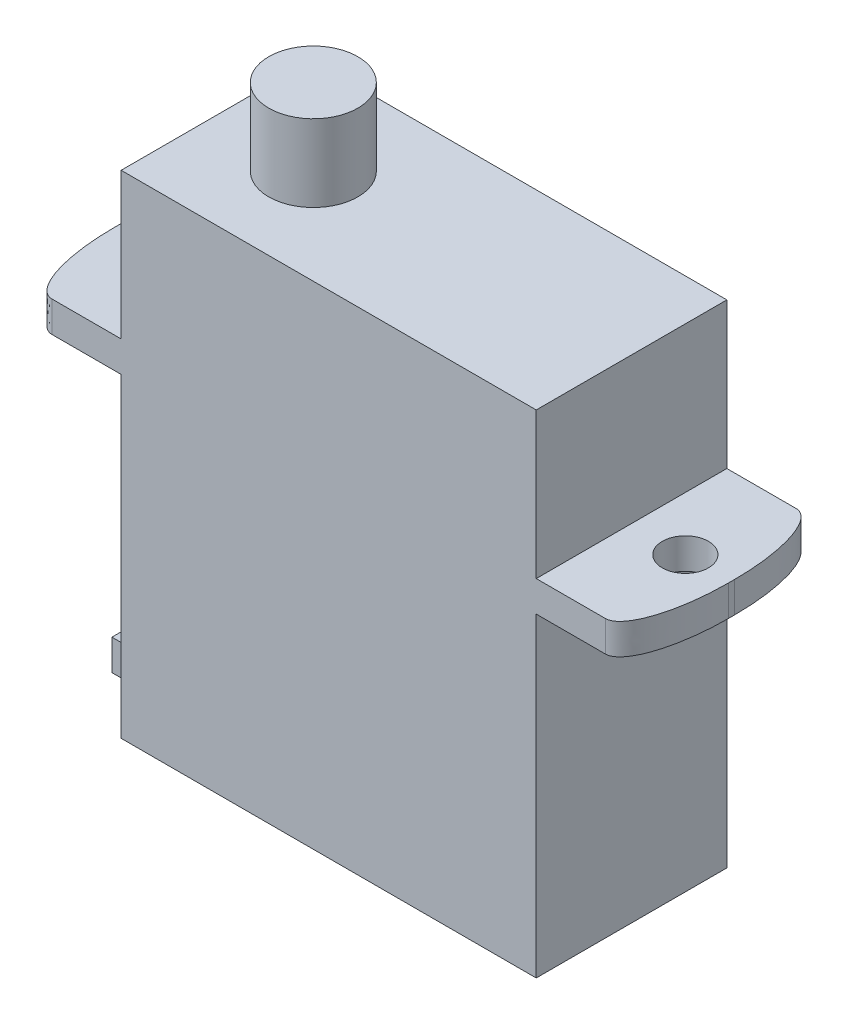
ISO-10303-21;
HEADER;
FILE_DESCRIPTION(('STEP AP214'),'2;1');
FILE_NAME('part.step','',(''),(''),'','','');
FILE_SCHEMA(('AUTOMOTIVE_DESIGN { 1 0 10303 214 1 1 1 1 }'));
ENDSEC;
DATA;
#1=APPLICATION_CONTEXT('core data for automotive mechanical design processes');
#2=APPLICATION_PROTOCOL_DEFINITION('international standard','automotive_design',2000,#1);
#3=PRODUCT_CONTEXT('',#1,'mechanical');
#4=PRODUCT('Part','Part','',(#3));
#5=PRODUCT_RELATED_PRODUCT_CATEGORY('part','',(#4));
#6=PRODUCT_DEFINITION_FORMATION('','',#4);
#7=PRODUCT_DEFINITION_CONTEXT('part definition',#1,'design');
#8=PRODUCT_DEFINITION('design','',#6,#7);
#9=PRODUCT_DEFINITION_SHAPE('','',#8);
#10=(LENGTH_UNIT() NAMED_UNIT(*) SI_UNIT(.MILLI.,.METRE.));
#11=(NAMED_UNIT(*) PLANE_ANGLE_UNIT() SI_UNIT($,.RADIAN.));
#12=(NAMED_UNIT(*) SI_UNIT($,.STERADIAN.) SOLID_ANGLE_UNIT());
#13=UNCERTAINTY_MEASURE_WITH_UNIT(LENGTH_MEASURE(1.E-05),#10,'distance_accuracy_value','');
#14=(GEOMETRIC_REPRESENTATION_CONTEXT(3) GLOBAL_UNCERTAINTY_ASSIGNED_CONTEXT((#13)) GLOBAL_UNIT_ASSIGNED_CONTEXT((#10,
#11,#12)) REPRESENTATION_CONTEXT('',''));
#15=CARTESIAN_POINT('',(0.,0.,0.));
#16=DIRECTION('',(0.,0.,1.));
#17=DIRECTION('',(1.,0.,0.));
#18=AXIS2_PLACEMENT_3D('',#15,#16,#17);
#19=CARTESIAN_POINT('',(-13.5,16.,0.));
#20=DIRECTION('',(1.,0.,0.));
#21=DIRECTION('',(0.,0.,-1.));
#22=AXIS2_PLACEMENT_3D('',#19,#20,#21);
#23=PLANE('',#22);
#24=DIRECTION('',(0.,-1.,0.));
#25=VECTOR('',#24,1.);
#26=CARTESIAN_POINT('',(-13.5,0.,-4.7));
#27=LINE('',#26,#25);
#28=CARTESIAN_POINT('',(-13.5,1.,-4.7));
#29=VERTEX_POINT('',#28);
#30=CARTESIAN_POINT('',(-13.5,0.,-4.7));
#31=VERTEX_POINT('',#30);
#32=EDGE_CURVE('E63',#29,#31,#27,.T.);
#33=ORIENTED_EDGE('',*,*,#32,.F.);
#34=DIRECTION('',(0.,0.,-1.));
#35=VECTOR('',#34,1.);
#36=CARTESIAN_POINT('',(-13.5,1.,-4.7));
#37=LINE('',#36,#35);
#38=CARTESIAN_POINT('',(-13.5,1.,-1.7));
#39=VERTEX_POINT('',#38);
#40=EDGE_CURVE('E67',#39,#29,#37,.T.);
#41=ORIENTED_EDGE('',*,*,#40,.F.);
#42=DIRECTION('',(0.,1.,0.));
#43=VECTOR('',#42,1.);
#44=CARTESIAN_POINT('',(-13.5,0.,-1.7));
#45=LINE('',#44,#43);
#46=CARTESIAN_POINT('',(-13.5,0.,-1.7));
#47=VERTEX_POINT('',#46);
#48=EDGE_CURVE('E928',#47,#39,#45,.T.);
#49=ORIENTED_EDGE('',*,*,#48,.F.);
#50=DIRECTION('',(0.,0.,1.));
#51=VECTOR('',#50,1.);
#52=CARTESIAN_POINT('',(-13.5,0.,0.));
#53=LINE('',#52,#51);
#54=CARTESIAN_POINT('',(-13.5,0.,0.));
#55=VERTEX_POINT('',#54);
#56=EDGE_CURVE('E607',#47,#55,#53,.T.);
#57=ORIENTED_EDGE('',*,*,#56,.T.);
#58=DIRECTION('',(0.,-1.,0.));
#59=VECTOR('',#58,1.);
#60=CARTESIAN_POINT('',(-13.5,16.,0.));
#61=LINE('',#60,#59);
#62=CARTESIAN_POINT('',(-13.5,10.25,0.));
#63=VERTEX_POINT('',#62);
#64=EDGE_CURVE('E594',#63,#55,#61,.T.);
#65=ORIENTED_EDGE('',*,*,#64,.F.);
#66=DIRECTION('',(0.,0.,1.));
#67=VECTOR('',#66,1.);
#68=CARTESIAN_POINT('',(-13.5,10.25,-6.2));
#69=LINE('',#68,#67);
#70=CARTESIAN_POINT('',(-13.5,10.25,-6.2));
#71=VERTEX_POINT('',#70);
#72=EDGE_CURVE('E229',#71,#63,#69,.T.);
#73=ORIENTED_EDGE('',*,*,#72,.F.);
#74=DIRECTION('',(0.,-1.,0.));
#75=VECTOR('',#74,1.);
#76=CARTESIAN_POINT('',(-13.5,16.,-6.2));
#77=LINE('',#76,#75);
#78=CARTESIAN_POINT('',(-13.5,0.,-6.2));
#79=VERTEX_POINT('',#78);
#80=EDGE_CURVE('E589',#71,#79,#77,.T.);
#81=ORIENTED_EDGE('',*,*,#80,.T.);
#82=EDGE_CURVE('E605',#79,#31,#53,.T.);
#83=ORIENTED_EDGE('',*,*,#82,.T.);
#84=EDGE_LOOP('',(#33,#41,#49,#57,#65,#73,#81,#83));
#85=FACE_BOUND('',#84,.T.);
#86=ADVANCED_FACE('F42',(#85),#23,.F.);
#87=CARTESIAN_POINT('',(0.,16.,0.));
#88=DIRECTION('',(-1.,0.,0.));
#89=DIRECTION('',(0.,0.,1.));
#90=AXIS2_PLACEMENT_3D('',#87,#88,#89);
#91=PLANE('',#90);
#92=DIRECTION('',(0.,0.,1.));
#93=VECTOR('',#92,1.);
#94=CARTESIAN_POINT('',(0.,11.25,-6.2));
#95=LINE('',#94,#93);
#96=CARTESIAN_POINT('',(0.,11.25,-6.2));
#97=VERTEX_POINT('',#96);
#98=CARTESIAN_POINT('',(0.,11.25,0.));
#99=VERTEX_POINT('',#98);
#100=EDGE_CURVE('E540',#97,#99,#95,.T.);
#101=ORIENTED_EDGE('',*,*,#100,.F.);
#102=DIRECTION('',(0.,-1.,0.));
#103=VECTOR('',#102,1.);
#104=CARTESIAN_POINT('',(0.,16.,-6.2));
#105=LINE('',#104,#103);
#106=CARTESIAN_POINT('',(0.,16.,-6.2));
#107=VERTEX_POINT('',#106);
#108=EDGE_CURVE('E450',#107,#97,#105,.T.);
#109=ORIENTED_EDGE('',*,*,#108,.F.);
#110=DIRECTION('',(0.,0.,-1.));
#111=VECTOR('',#110,1.);
#112=CARTESIAN_POINT('',(0.,16.,0.));
#113=LINE('',#112,#111);
#114=CARTESIAN_POINT('',(0.,16.,0.));
#115=VERTEX_POINT('',#114);
#116=EDGE_CURVE('E550',#115,#107,#113,.T.);
#117=ORIENTED_EDGE('',*,*,#116,.F.);
#118=DIRECTION('',(0.,-1.,0.));
#119=VECTOR('',#118,1.);
#120=CARTESIAN_POINT('',(0.,16.,0.));
#121=LINE('',#120,#119);
#122=EDGE_CURVE('E597',#115,#99,#121,.T.);
#123=ORIENTED_EDGE('',*,*,#122,.T.);
#124=EDGE_LOOP('',(#101,#109,#117,#123));
#125=FACE_BOUND('',#124,.T.);
#126=ADVANCED_FACE('F569',(#125),#91,.F.);
#127=CARTESIAN_POINT('',(0.,10.25,-6.2));
#128=VERTEX_POINT('',#127);
#129=CARTESIAN_POINT('',(0.,0.,-6.2));
#130=VERTEX_POINT('',#129);
#131=EDGE_CURVE('E455',#128,#130,#105,.T.);
#132=ORIENTED_EDGE('',*,*,#131,.F.);
#133=DIRECTION('',(0.,0.,1.));
#134=VECTOR('',#133,1.);
#135=CARTESIAN_POINT('',(0.,10.25,-6.2));
#136=LINE('',#135,#134);
#137=CARTESIAN_POINT('',(0.,10.25,0.));
#138=VERTEX_POINT('',#137);
#139=EDGE_CURVE('E535',#128,#138,#136,.T.);
#140=ORIENTED_EDGE('',*,*,#139,.T.);
#141=CARTESIAN_POINT('',(0.,0.,0.));
#142=VERTEX_POINT('',#141);
#143=EDGE_CURVE('E601',#138,#142,#121,.T.);
#144=ORIENTED_EDGE('',*,*,#143,.T.);
#145=DIRECTION('',(0.,0.,-1.));
#146=VECTOR('',#145,1.);
#147=CARTESIAN_POINT('',(0.,0.,0.));
#148=LINE('',#147,#146);
#149=EDGE_CURVE('E534',#142,#130,#148,.T.);
#150=ORIENTED_EDGE('',*,*,#149,.T.);
#151=EDGE_LOOP('',(#132,#140,#144,#150));
#152=FACE_BOUND('',#151,.T.);
#153=ADVANCED_FACE('F573',(#152),#91,.F.);
#154=CARTESIAN_POINT('',(0.,16.,-6.2));
#155=DIRECTION('',(0.,0.,1.));
#156=DIRECTION('',(1.,0.,0.));
#157=AXIS2_PLACEMENT_3D('',#154,#155,#156);
#158=PLANE('',#157);
#159=DIRECTION('',(1.,0.,0.));
#160=VECTOR('',#159,1.);
#161=CARTESIAN_POINT('',(0.,11.25,-6.2));
#162=LINE('',#161,#160);
#163=CARTESIAN_POINT('',(2.25,11.25,-6.2));
#164=VERTEX_POINT('',#163);
#165=EDGE_CURVE('E294',#97,#164,#162,.T.);
#166=ORIENTED_EDGE('',*,*,#165,.T.);
#167=CARTESIAN_POINT('',(2.25,10.2,-6.2));
#168=CARTESIAN_POINT('',(2.25,10.5666666666667,-6.2));
#169=CARTESIAN_POINT('',(2.25,10.9333333333333,-6.2));
#170=CARTESIAN_POINT('',(2.25,11.3,-6.2));
#171=(BOUNDED_CURVE() B_SPLINE_CURVE(3,(#167,#168,#169,#170),.UNSPECIFIED.,.F.,
.F.) B_SPLINE_CURVE_WITH_KNOTS((4,4),(0.0047,0.0058),
.UNSPECIFIED.) CURVE() GEOMETRIC_REPRESENTATION_ITEM() RATIONAL_B_SPLINE_CURVE((1.,1.,1.,1.)) REPRESENTATION_ITEM(''));
#172=CARTESIAN_POINT('',(2.25,10.25,-6.2));
#173=VERTEX_POINT('',#172);
#174=EDGE_CURVE('E508',#164,#173,#171,.F.);
#175=ORIENTED_EDGE('',*,*,#174,.T.);
#176=DIRECTION('',(1.,0.,0.));
#177=VECTOR('',#176,1.);
#178=CARTESIAN_POINT('',(0.,10.25,-6.2));
#179=LINE('',#178,#177);
#180=EDGE_CURVE('E303',#128,#173,#179,.T.);
#181=ORIENTED_EDGE('',*,*,#180,.F.);
#182=ORIENTED_EDGE('',*,*,#131,.T.);
#183=DIRECTION('',(-1.,0.,0.));
#184=VECTOR('',#183,1.);
#185=CARTESIAN_POINT('',(0.,0.,-6.2));
#186=LINE('',#185,#184);
#187=EDGE_CURVE('E537',#130,#79,#186,.T.);
#188=ORIENTED_EDGE('',*,*,#187,.T.);
#189=ORIENTED_EDGE('',*,*,#80,.F.);
#190=DIRECTION('',(-1.,0.,0.));
#191=VECTOR('',#190,1.);
#192=CARTESIAN_POINT('',(-13.5,10.25,-6.2));
#193=LINE('',#192,#191);
#194=CARTESIAN_POINT('',(-15.75,10.25,-6.2));
#195=VERTEX_POINT('',#194);
#196=EDGE_CURVE('E254',#71,#195,#193,.T.);
#197=ORIENTED_EDGE('',*,*,#196,.T.);
#198=CARTESIAN_POINT('',(-15.75,11.3,-6.2));
#199=CARTESIAN_POINT('',(-15.75,10.9333333333333,-6.2));
#200=CARTESIAN_POINT('',(-15.75,10.5666666666667,-6.2));
#201=CARTESIAN_POINT('',(-15.75,10.2,-6.2));
#202=(BOUNDED_CURVE() B_SPLINE_CURVE(3,(#198,#199,#200,#201),.UNSPECIFIED.,.F.,
.F.) B_SPLINE_CURVE_WITH_KNOTS((4,4),(-0.00105,5.00000000000001E-05),
.UNSPECIFIED.) CURVE() GEOMETRIC_REPRESENTATION_ITEM() RATIONAL_B_SPLINE_CURVE((1.,1.,1.,1.)) REPRESENTATION_ITEM(''));
#203=CARTESIAN_POINT('',(-15.75,11.25,-6.2));
#204=VERTEX_POINT('',#203);
#205=EDGE_CURVE('E430',#195,#204,#202,.F.);
#206=ORIENTED_EDGE('',*,*,#205,.T.);
#207=DIRECTION('',(-1.,0.,0.));
#208=VECTOR('',#207,1.);
#209=CARTESIAN_POINT('',(-13.5,11.25,-6.2));
#210=LINE('',#209,#208);
#211=CARTESIAN_POINT('',(-13.5,11.25,-6.2));
#212=VERTEX_POINT('',#211);
#213=EDGE_CURVE('E618',#212,#204,#210,.T.);
#214=ORIENTED_EDGE('',*,*,#213,.F.);
#215=CARTESIAN_POINT('',(-13.5,16.,-6.2));
#216=VERTEX_POINT('',#215);
#217=EDGE_CURVE('E458',#216,#212,#77,.T.);
#218=ORIENTED_EDGE('',*,*,#217,.F.);
#219=DIRECTION('',(-1.,0.,0.));
#220=VECTOR('',#219,1.);
#221=CARTESIAN_POINT('',(0.,16.,-6.2));
#222=LINE('',#221,#220);
#223=EDGE_CURVE('E611',#107,#216,#222,.T.);
#224=ORIENTED_EDGE('',*,*,#223,.F.);
#225=ORIENTED_EDGE('',*,*,#108,.T.);
#226=EDGE_LOOP('',(#166,#175,#181,#182,#188,#189,#197,#206,#214,#218,#224,#225));
#227=FACE_BOUND('',#226,.T.);
#228=ADVANCED_FACE('F506',(#227),#158,.F.);
#229=ORIENTED_EDGE('',*,*,#217,.T.);
#230=DIRECTION('',(0.,0.,1.));
#231=VECTOR('',#230,1.);
#232=CARTESIAN_POINT('',(-13.5,11.25,-6.2));
#233=LINE('',#232,#231);
#234=CARTESIAN_POINT('',(-13.5,11.25,0.));
#235=VERTEX_POINT('',#234);
#236=EDGE_CURVE('E586',#212,#235,#233,.T.);
#237=ORIENTED_EDGE('',*,*,#236,.T.);
#238=CARTESIAN_POINT('',(-13.5,16.,0.));
#239=VERTEX_POINT('',#238);
#240=EDGE_CURVE('E590',#239,#235,#61,.T.);
#241=ORIENTED_EDGE('',*,*,#240,.F.);
#242=DIRECTION('',(0.,0.,1.));
#243=VECTOR('',#242,1.);
#244=CARTESIAN_POINT('',(-13.5,16.,0.));
#245=LINE('',#244,#243);
#246=EDGE_CURVE('E588',#216,#239,#245,.T.);
#247=ORIENTED_EDGE('',*,*,#246,.F.);
#248=EDGE_LOOP('',(#229,#237,#241,#247));
#249=FACE_BOUND('',#248,.T.);
#250=ADVANCED_FACE('F347',(#249),#23,.F.);
#251=CARTESIAN_POINT('',(0.,16.,0.));
#252=DIRECTION('',(0.,0.,-1.));
#253=DIRECTION('',(-1.,0.,0.));
#254=AXIS2_PLACEMENT_3D('',#251,#252,#253);
#255=PLANE('',#254);
#256=DIRECTION('',(-1.,0.,0.));
#257=VECTOR('',#256,1.);
#258=CARTESIAN_POINT('',(-13.5,11.25,0.));
#259=LINE('',#258,#257);
#260=CARTESIAN_POINT('',(-15.75,11.25,0.));
#261=VERTEX_POINT('',#260);
#262=EDGE_CURVE('E616',#235,#261,#259,.T.);
#263=ORIENTED_EDGE('',*,*,#262,.T.);
#264=CARTESIAN_POINT('',(-15.75,10.2,0.));
#265=CARTESIAN_POINT('',(-15.75,10.5666666666667,0.));
#266=CARTESIAN_POINT('',(-15.75,10.9333333333333,0.));
#267=CARTESIAN_POINT('',(-15.75,11.3,0.));
#268=(BOUNDED_CURVE() B_SPLINE_CURVE(3,(#264,#265,#266,#267),.UNSPECIFIED.,.F.,
.F.) B_SPLINE_CURVE_WITH_KNOTS((4,4),(-0.0058,-0.0047),
.UNSPECIFIED.) CURVE() GEOMETRIC_REPRESENTATION_ITEM() RATIONAL_B_SPLINE_CURVE((1.,1.,1.,1.)) REPRESENTATION_ITEM(''));
#269=CARTESIAN_POINT('',(-15.75,10.25,0.));
#270=VERTEX_POINT('',#269);
#271=EDGE_CURVE('E378',#261,#270,#268,.F.);
#272=ORIENTED_EDGE('',*,*,#271,.T.);
#273=DIRECTION('',(-1.,0.,0.));
#274=VECTOR('',#273,1.);
#275=CARTESIAN_POINT('',(-13.5,10.25,0.));
#276=LINE('',#275,#274);
#277=EDGE_CURVE('E321',#63,#270,#276,.T.);
#278=ORIENTED_EDGE('',*,*,#277,.F.);
#279=ORIENTED_EDGE('',*,*,#64,.T.);
#280=DIRECTION('',(1.,0.,0.));
#281=VECTOR('',#280,1.);
#282=CARTESIAN_POINT('',(0.,0.,0.));
#283=LINE('',#282,#281);
#284=EDGE_CURVE('E602',#55,#142,#283,.T.);
#285=ORIENTED_EDGE('',*,*,#284,.T.);
#286=ORIENTED_EDGE('',*,*,#143,.F.);
#287=DIRECTION('',(1.,0.,0.));
#288=VECTOR('',#287,1.);
#289=CARTESIAN_POINT('',(0.,10.25,0.));
#290=LINE('',#289,#288);
#291=CARTESIAN_POINT('',(2.25,10.25,0.));
#292=VERTEX_POINT('',#291);
#293=EDGE_CURVE('E304',#138,#292,#290,.T.);
#294=ORIENTED_EDGE('',*,*,#293,.T.);
#295=CARTESIAN_POINT('',(2.25,11.3,0.));
#296=CARTESIAN_POINT('',(2.25,10.9333333333333,0.));
#297=CARTESIAN_POINT('',(2.25,10.5666666666667,0.));
#298=CARTESIAN_POINT('',(2.25,10.2,0.));
#299=(BOUNDED_CURVE() B_SPLINE_CURVE(3,(#295,#296,#297,#298),.UNSPECIFIED.,.F.,
.F.) B_SPLINE_CURVE_WITH_KNOTS((4,4),(-0.0113,-0.0102),
.UNSPECIFIED.) CURVE() GEOMETRIC_REPRESENTATION_ITEM() RATIONAL_B_SPLINE_CURVE((1.,1.,1.,1.)) REPRESENTATION_ITEM(''));
#300=CARTESIAN_POINT('',(2.25,11.25,0.));
#301=VERTEX_POINT('',#300);
#302=EDGE_CURVE('E330',#292,#301,#299,.F.);
#303=ORIENTED_EDGE('',*,*,#302,.T.);
#304=DIRECTION('',(1.,0.,0.));
#305=VECTOR('',#304,1.);
#306=CARTESIAN_POINT('',(0.,11.25,0.));
#307=LINE('',#306,#305);
#308=EDGE_CURVE('E317',#99,#301,#307,.T.);
#309=ORIENTED_EDGE('',*,*,#308,.F.);
#310=ORIENTED_EDGE('',*,*,#122,.F.);
#311=DIRECTION('',(1.,0.,0.));
#312=VECTOR('',#311,1.);
#313=CARTESIAN_POINT('',(0.,16.,0.));
#314=LINE('',#313,#312);
#315=EDGE_CURVE('E609',#239,#115,#314,.T.);
#316=ORIENTED_EDGE('',*,*,#315,.F.);
#317=ORIENTED_EDGE('',*,*,#240,.T.);
#318=EDGE_LOOP('',(#263,#272,#278,#279,#285,#286,#294,#303,#309,#310,#316,#317));
#319=FACE_BOUND('',#318,.T.);
#320=ADVANCED_FACE('F336',(#319),#255,.F.);
#321=CARTESIAN_POINT('',(0.,16.,0.));
#322=DIRECTION('',(0.,1.,0.));
#323=DIRECTION('',(0.,0.,1.));
#324=AXIS2_PLACEMENT_3D('',#321,#322,#323);
#325=PLANE('',#324);
#326=CARTESIAN_POINT('',(-10.35,16.,-3.1));
#327=DIRECTION('',(0.,1.,0.));
#328=DIRECTION('',(0.,0.,1.));
#329=AXIS2_PLACEMENT_3D('',#326,#327,#328);
#330=CIRCLE('',#329,1.45);
#331=CARTESIAN_POINT('',(-10.35,16.,-1.65));
#332=VERTEX_POINT('',#331);
#333=EDGE_CURVE('E206',#332,#332,#330,.T.);
#334=ORIENTED_EDGE('',*,*,#333,.F.);
#335=EDGE_LOOP('',(#334));
#336=FACE_BOUND('',#335,.T.);
#337=ORIENTED_EDGE('',*,*,#116,.T.);
#338=ORIENTED_EDGE('',*,*,#223,.T.);
#339=ORIENTED_EDGE('',*,*,#246,.T.);
#340=ORIENTED_EDGE('',*,*,#315,.T.);
#341=EDGE_LOOP('',(#337,#338,#339,#340));
#342=FACE_BOUND('',#341,.T.);
#343=ADVANCED_FACE('F346',(#336,#342),#325,.T.);
#344=CARTESIAN_POINT('',(0.,0.,0.));
#345=DIRECTION('',(0.,1.,0.));
#346=DIRECTION('',(0.,0.,1.));
#347=AXIS2_PLACEMENT_3D('',#344,#345,#346);
#348=PLANE('',#347);
#349=ORIENTED_EDGE('',*,*,#149,.F.);
#350=ORIENTED_EDGE('',*,*,#284,.F.);
#351=ORIENTED_EDGE('',*,*,#56,.F.);
#352=DIRECTION('',(1.,0.,0.));
#353=VECTOR('',#352,1.);
#354=CARTESIAN_POINT('',(-15.5,0.,-1.7));
#355=LINE('',#354,#353);
#356=CARTESIAN_POINT('',(-15.5,0.,-1.7));
#357=VERTEX_POINT('',#356);
#358=EDGE_CURVE('E191',#357,#47,#355,.T.);
#359=ORIENTED_EDGE('',*,*,#358,.F.);
#360=DIRECTION('',(0.,0.,1.));
#361=VECTOR('',#360,1.);
#362=CARTESIAN_POINT('',(-15.5,0.,-4.7));
#363=LINE('',#362,#361);
#364=CARTESIAN_POINT('',(-15.5,0.,-4.7));
#365=VERTEX_POINT('',#364);
#366=EDGE_CURVE('E183',#365,#357,#363,.T.);
#367=ORIENTED_EDGE('',*,*,#366,.F.);
#368=DIRECTION('',(1.,0.,0.));
#369=VECTOR('',#368,1.);
#370=CARTESIAN_POINT('',(-15.5,0.,-4.7));
#371=LINE('',#370,#369);
#372=EDGE_CURVE('E189',#365,#31,#371,.T.);
#373=ORIENTED_EDGE('',*,*,#372,.T.);
#374=ORIENTED_EDGE('',*,*,#82,.F.);
#375=ORIENTED_EDGE('',*,*,#187,.F.);
#376=EDGE_LOOP('',(#349,#350,#351,#359,#367,#373,#374,#375));
#377=FACE_BOUND('',#376,.T.);
#378=ADVANCED_FACE('F186',(#377),#348,.F.);
#379=CARTESIAN_POINT('',(3.25,0.,-6.2));
#380=DIRECTION('',(-1.,0.,0.));
#381=DIRECTION('',(0.,-1.,0.));
#382=AXIS2_PLACEMENT_3D('',#379,#380,#381);
#383=PLANE('',#382);
#384=DIRECTION('',(0.,0.,1.));
#385=VECTOR('',#384,1.);
#386=CARTESIAN_POINT('',(3.25,10.25,-6.2));
#387=LINE('',#386,#385);
#388=CARTESIAN_POINT('',(3.25,10.25,-3.2));
#389=VERTEX_POINT('',#388);
#390=CARTESIAN_POINT('',(3.25,10.25,-3.));
#391=VERTEX_POINT('',#390);
#392=EDGE_CURVE('E531',#389,#391,#387,.T.);
#393=ORIENTED_EDGE('',*,*,#392,.F.);
#394=CARTESIAN_POINT('',(3.25,11.3,-3.2));
#395=CARTESIAN_POINT('',(3.25,10.9333333333333,-3.2));
#396=CARTESIAN_POINT('',(3.25,10.5666666666667,-3.2));
#397=CARTESIAN_POINT('',(3.25,10.2,-3.2));
#398=(BOUNDED_CURVE() B_SPLINE_CURVE(3,(#394,#395,#396,#397),.UNSPECIFIED.,.F.,
.F.) B_SPLINE_CURVE_WITH_KNOTS((4,4),(0.0047,0.0058),
.UNSPECIFIED.) CURVE() GEOMETRIC_REPRESENTATION_ITEM() RATIONAL_B_SPLINE_CURVE((1.,1.,1.,1.)) REPRESENTATION_ITEM(''));
#399=CARTESIAN_POINT('',(3.25,11.25,-3.2));
#400=VERTEX_POINT('',#399);
#401=EDGE_CURVE('E56',#389,#400,#398,.F.);
#402=ORIENTED_EDGE('',*,*,#401,.T.);
#403=DIRECTION('',(0.,0.,1.));
#404=VECTOR('',#403,1.);
#405=CARTESIAN_POINT('',(3.25,11.25,-6.2));
#406=LINE('',#405,#404);
#407=CARTESIAN_POINT('',(3.25,11.25,-3.));
#408=VERTEX_POINT('',#407);
#409=EDGE_CURVE('E500',#400,#408,#406,.T.);
#410=ORIENTED_EDGE('',*,*,#409,.T.);
#411=CARTESIAN_POINT('',(3.25,10.2,-3.));
#412=CARTESIAN_POINT('',(3.25,10.5666666666667,-3.));
#413=CARTESIAN_POINT('',(3.25,10.9333333333333,-3.));
#414=CARTESIAN_POINT('',(3.25,11.3,-3.));
#415=(BOUNDED_CURVE() B_SPLINE_CURVE(3,(#411,#412,#413,#414),.UNSPECIFIED.,.F.,
.F.) B_SPLINE_CURVE_WITH_KNOTS((4,4),(-0.0113,-0.0102),
.UNSPECIFIED.) CURVE() GEOMETRIC_REPRESENTATION_ITEM() RATIONAL_B_SPLINE_CURVE((1.,1.,1.,1.)) REPRESENTATION_ITEM(''));
#416=EDGE_CURVE('E446',#408,#391,#415,.F.);
#417=ORIENTED_EDGE('',*,*,#416,.T.);
#418=EDGE_LOOP('',(#393,#402,#410,#417));
#419=FACE_BOUND('',#418,.T.);
#420=ADVANCED_FACE('F466',(#419),#383,.F.);
#421=CARTESIAN_POINT('',(0.,10.25,-6.2));
#422=DIRECTION('',(0.,-1.,0.));
#423=DIRECTION('',(0.,0.,-1.));
#424=AXIS2_PLACEMENT_3D('',#421,#422,#423);
#425=PLANE('',#424);
#426=CARTESIAN_POINT('',(1.75,10.25,-3.1));
#427=DIRECTION('',(0.,-1.,0.));
#428=DIRECTION('',(0.,0.,-1.));
#429=AXIS2_PLACEMENT_3D('',#426,#427,#428);
#430=CIRCLE('',#429,0.75);
#431=CARTESIAN_POINT('',(1.75,10.25,-2.35));
#432=VERTEX_POINT('',#431);
#433=EDGE_CURVE('E220',#432,#432,#430,.T.);
#434=ORIENTED_EDGE('',*,*,#433,.F.);
#435=EDGE_LOOP('',(#434));
#436=FACE_BOUND('',#435,.T.);
#437=ORIENTED_EDGE('',*,*,#180,.T.);
#438=CARTESIAN_POINT('',(3.25,10.25,-3.2));
#439=CARTESIAN_POINT('',(3.25,10.25,-6.2));
#440=CARTESIAN_POINT('',(2.25,10.25,-6.2));
#441=(BOUNDED_CURVE() B_SPLINE_CURVE(2,(#438,#439,#440),.UNSPECIFIED.,.F.,
.F.) B_SPLINE_CURVE_WITH_KNOTS((3,3),(0.,1.),
.UNSPECIFIED.) CURVE() GEOMETRIC_REPRESENTATION_ITEM() RATIONAL_B_SPLINE_CURVE((1.,
0.707106781186547,1.)) REPRESENTATION_ITEM(''));
#442=EDGE_CURVE('E511',#173,#389,#441,.F.);
#443=ORIENTED_EDGE('',*,*,#442,.T.);
#444=ORIENTED_EDGE('',*,*,#392,.T.);
#445=CARTESIAN_POINT('',(2.25,10.25,0.));
#446=CARTESIAN_POINT('',(3.25,10.25,0.));
#447=CARTESIAN_POINT('',(3.25,10.25,-3.));
#448=(BOUNDED_CURVE() B_SPLINE_CURVE(2,(#445,#446,#447),.UNSPECIFIED.,.F.,
.F.) B_SPLINE_CURVE_WITH_KNOTS((3,3),(0.,1.),
.UNSPECIFIED.) CURVE() GEOMETRIC_REPRESENTATION_ITEM() RATIONAL_B_SPLINE_CURVE((1.,
0.707106781186548,1.)) REPRESENTATION_ITEM(''));
#449=EDGE_CURVE('E445',#391,#292,#448,.F.);
#450=ORIENTED_EDGE('',*,*,#449,.T.);
#451=ORIENTED_EDGE('',*,*,#293,.F.);
#452=ORIENTED_EDGE('',*,*,#139,.F.);
#453=EDGE_LOOP('',(#437,#443,#444,#450,#451,#452));
#454=FACE_BOUND('',#453,.T.);
#455=ADVANCED_FACE('F475',(#436,#454),#425,.T.);
#456=CARTESIAN_POINT('',(0.,11.25,-6.2));
#457=DIRECTION('',(0.,-1.,0.));
#458=DIRECTION('',(0.,0.,-1.));
#459=AXIS2_PLACEMENT_3D('',#456,#457,#458);
#460=PLANE('',#459);
#461=CARTESIAN_POINT('',(1.75,11.25,-3.1));
#462=DIRECTION('',(0.,1.,0.));
#463=DIRECTION('',(0.,0.,1.));
#464=AXIS2_PLACEMENT_3D('',#461,#462,#463);
#465=CIRCLE('',#464,0.75);
#466=CARTESIAN_POINT('',(1.75,11.25,-2.35));
#467=VERTEX_POINT('',#466);
#468=EDGE_CURVE('E216',#467,#467,#465,.T.);
#469=ORIENTED_EDGE('',*,*,#468,.F.);
#470=EDGE_LOOP('',(#469));
#471=FACE_BOUND('',#470,.T.);
#472=ORIENTED_EDGE('',*,*,#409,.F.);
#473=CARTESIAN_POINT('',(2.25,11.25,-6.2));
#474=CARTESIAN_POINT('',(3.25,11.25,-6.2));
#475=CARTESIAN_POINT('',(3.25,11.25,-3.2));
#476=(BOUNDED_CURVE() B_SPLINE_CURVE(2,(#473,#474,#475),.UNSPECIFIED.,.F.,
.F.) B_SPLINE_CURVE_WITH_KNOTS((3,3),(0.,1.),
.UNSPECIFIED.) CURVE() GEOMETRIC_REPRESENTATION_ITEM() RATIONAL_B_SPLINE_CURVE((1.,
0.707106781186547,1.)) REPRESENTATION_ITEM(''));
#477=EDGE_CURVE('E12',#400,#164,#476,.F.);
#478=ORIENTED_EDGE('',*,*,#477,.T.);
#479=ORIENTED_EDGE('',*,*,#165,.F.);
#480=ORIENTED_EDGE('',*,*,#100,.T.);
#481=ORIENTED_EDGE('',*,*,#308,.T.);
#482=CARTESIAN_POINT('',(3.25,11.25,-3.));
#483=CARTESIAN_POINT('',(3.25,11.25,0.));
#484=CARTESIAN_POINT('',(2.25,11.25,0.));
#485=(BOUNDED_CURVE() B_SPLINE_CURVE(2,(#482,#483,#484),.UNSPECIFIED.,.F.,
.F.) B_SPLINE_CURVE_WITH_KNOTS((3,3),(0.,1.),
.UNSPECIFIED.) CURVE() GEOMETRIC_REPRESENTATION_ITEM() RATIONAL_B_SPLINE_CURVE((1.,
0.707106781186548,1.)) REPRESENTATION_ITEM(''));
#486=EDGE_CURVE('E440',#301,#408,#485,.F.);
#487=ORIENTED_EDGE('',*,*,#486,.T.);
#488=EDGE_LOOP('',(#472,#478,#479,#480,#481,#487));
#489=FACE_BOUND('',#488,.T.);
#490=ADVANCED_FACE('F476',(#471,#489),#460,.F.);
#491=CARTESIAN_POINT('',(-13.5,10.25,-6.2));
#492=DIRECTION('',(0.,1.,0.));
#493=DIRECTION('',(0.,0.,1.));
#494=AXIS2_PLACEMENT_3D('',#491,#492,#493);
#495=PLANE('',#494);
#496=CARTESIAN_POINT('',(-15.25,10.25,-3.1));
#497=DIRECTION('',(0.,1.,0.));
#498=DIRECTION('',(0.,0.,1.));
#499=AXIS2_PLACEMENT_3D('',#496,#497,#498);
#500=CIRCLE('',#499,0.75);
#501=CARTESIAN_POINT('',(-15.25,10.25,-2.35));
#502=VERTEX_POINT('',#501);
#503=EDGE_CURVE('E226',#502,#502,#500,.T.);
#504=ORIENTED_EDGE('',*,*,#503,.T.);
#505=EDGE_LOOP('',(#504));
#506=FACE_BOUND('',#505,.T.);
#507=ORIENTED_EDGE('',*,*,#277,.T.);
#508=CARTESIAN_POINT('',(-16.75,10.25,-3.));
#509=CARTESIAN_POINT('',(-16.75,10.25,0.));
#510=CARTESIAN_POINT('',(-15.75,10.25,0.));
#511=(BOUNDED_CURVE() B_SPLINE_CURVE(2,(#508,#509,#510),.UNSPECIFIED.,.F.,
.F.) B_SPLINE_CURVE_WITH_KNOTS((3,3),(0.,1.),
.UNSPECIFIED.) CURVE() GEOMETRIC_REPRESENTATION_ITEM() RATIONAL_B_SPLINE_CURVE((1.,
0.707106781186548,1.)) REPRESENTATION_ITEM(''));
#512=CARTESIAN_POINT('',(-16.75,10.25,-3.));
#513=VERTEX_POINT('',#512);
#514=EDGE_CURVE('E365',#270,#513,#511,.F.);
#515=ORIENTED_EDGE('',*,*,#514,.T.);
#516=DIRECTION('',(0.,0.,1.));
#517=VECTOR('',#516,1.);
#518=CARTESIAN_POINT('',(-16.75,10.25,-6.2));
#519=LINE('',#518,#517);
#520=CARTESIAN_POINT('',(-16.75,10.25,-3.2));
#521=VERTEX_POINT('',#520);
#522=EDGE_CURVE('E232',#521,#513,#519,.T.);
#523=ORIENTED_EDGE('',*,*,#522,.F.);
#524=CARTESIAN_POINT('',(-15.75,10.25,-6.2));
#525=CARTESIAN_POINT('',(-16.75,10.25,-6.2));
#526=CARTESIAN_POINT('',(-16.75,10.25,-3.2));
#527=(BOUNDED_CURVE() B_SPLINE_CURVE(2,(#524,#525,#526),.UNSPECIFIED.,.F.,
.F.) B_SPLINE_CURVE_WITH_KNOTS((3,3),(0.,1.),
.UNSPECIFIED.) CURVE() GEOMETRIC_REPRESENTATION_ITEM() RATIONAL_B_SPLINE_CURVE((1.,
0.707106781186548,1.)) REPRESENTATION_ITEM(''));
#528=EDGE_CURVE('E434',#521,#195,#527,.F.);
#529=ORIENTED_EDGE('',*,*,#528,.T.);
#530=ORIENTED_EDGE('',*,*,#196,.F.);
#531=ORIENTED_EDGE('',*,*,#72,.T.);
#532=EDGE_LOOP('',(#507,#515,#523,#529,#530,#531));
#533=FACE_BOUND('',#532,.T.);
#534=ADVANCED_FACE('F268',(#506,#533),#495,.F.);
#535=CARTESIAN_POINT('',(-16.75,11.25,-6.2));
#536=DIRECTION('',(-1.,0.,0.));
#537=DIRECTION('',(0.,0.,1.));
#538=AXIS2_PLACEMENT_3D('',#535,#536,#537);
#539=PLANE('',#538);
#540=ORIENTED_EDGE('',*,*,#522,.T.);
#541=CARTESIAN_POINT('',(-16.75,11.3,-3.));
#542=CARTESIAN_POINT('',(-16.75,10.9333333333333,-3.));
#543=CARTESIAN_POINT('',(-16.75,10.5666666666667,-3.));
#544=CARTESIAN_POINT('',(-16.75,10.2,-3.));
#545=(BOUNDED_CURVE() B_SPLINE_CURVE(3,(#541,#542,#543,#544),.UNSPECIFIED.,.F.,
.F.) B_SPLINE_CURVE_WITH_KNOTS((4,4),(-0.0058,-0.0047),
.UNSPECIFIED.) CURVE() GEOMETRIC_REPRESENTATION_ITEM() RATIONAL_B_SPLINE_CURVE((1.,1.,1.,1.)) REPRESENTATION_ITEM(''));
#546=CARTESIAN_POINT('',(-16.75,11.25,-3.));
#547=VERTEX_POINT('',#546);
#548=EDGE_CURVE('E377',#513,#547,#545,.F.);
#549=ORIENTED_EDGE('',*,*,#548,.T.);
#550=DIRECTION('',(0.,0.,1.));
#551=VECTOR('',#550,1.);
#552=CARTESIAN_POINT('',(-16.75,11.25,-6.2));
#553=LINE('',#552,#551);
#554=CARTESIAN_POINT('',(-16.75,11.25,-3.2));
#555=VERTEX_POINT('',#554);
#556=EDGE_CURVE('E241',#555,#547,#553,.T.);
#557=ORIENTED_EDGE('',*,*,#556,.F.);
#558=CARTESIAN_POINT('',(-16.75,10.2,-3.2));
#559=CARTESIAN_POINT('',(-16.75,10.5666666666667,-3.2));
#560=CARTESIAN_POINT('',(-16.75,10.9333333333333,-3.2));
#561=CARTESIAN_POINT('',(-16.75,11.3,-3.2));
#562=(BOUNDED_CURVE() B_SPLINE_CURVE(3,(#558,#559,#560,#561),.UNSPECIFIED.,.F.,
.F.) B_SPLINE_CURVE_WITH_KNOTS((4,4),(-0.00105,5.E-05),
.UNSPECIFIED.) CURVE() GEOMETRIC_REPRESENTATION_ITEM() RATIONAL_B_SPLINE_CURVE((1.,1.,1.,1.)) REPRESENTATION_ITEM(''));
#563=EDGE_CURVE('E248',#555,#521,#562,.F.);
#564=ORIENTED_EDGE('',*,*,#563,.T.);
#565=EDGE_LOOP('',(#540,#549,#557,#564));
#566=FACE_BOUND('',#565,.T.);
#567=ADVANCED_FACE('F257',(#566),#539,.T.);
#568=CARTESIAN_POINT('',(-13.5,11.25,-6.2));
#569=DIRECTION('',(0.,1.,0.));
#570=DIRECTION('',(0.,0.,1.));
#571=AXIS2_PLACEMENT_3D('',#568,#569,#570);
#572=PLANE('',#571);
#573=CARTESIAN_POINT('',(-15.25,11.25,-3.1));
#574=DIRECTION('',(0.,1.,0.));
#575=DIRECTION('',(0.,0.,1.));
#576=AXIS2_PLACEMENT_3D('',#573,#574,#575);
#577=CIRCLE('',#576,0.75);
#578=CARTESIAN_POINT('',(-15.25,11.25,-2.35));
#579=VERTEX_POINT('',#578);
#580=EDGE_CURVE('E223',#579,#579,#577,.T.);
#581=ORIENTED_EDGE('',*,*,#580,.F.);
#582=EDGE_LOOP('',(#581));
#583=FACE_BOUND('',#582,.T.);
#584=ORIENTED_EDGE('',*,*,#556,.T.);
#585=CARTESIAN_POINT('',(-15.75,11.25,0.));
#586=CARTESIAN_POINT('',(-16.75,11.25,0.));
#587=CARTESIAN_POINT('',(-16.75,11.25,-3.));
#588=(BOUNDED_CURVE() B_SPLINE_CURVE(2,(#585,#586,#587),.UNSPECIFIED.,.F.,
.F.) B_SPLINE_CURVE_WITH_KNOTS((3,3),(0.,1.),
.UNSPECIFIED.) CURVE() GEOMETRIC_REPRESENTATION_ITEM() RATIONAL_B_SPLINE_CURVE((1.,
0.707106781186548,1.)) REPRESENTATION_ITEM(''));
#589=EDGE_CURVE('E289',#547,#261,#588,.F.);
#590=ORIENTED_EDGE('',*,*,#589,.T.);
#591=ORIENTED_EDGE('',*,*,#262,.F.);
#592=ORIENTED_EDGE('',*,*,#236,.F.);
#593=ORIENTED_EDGE('',*,*,#213,.T.);
#594=CARTESIAN_POINT('',(-16.75,11.25,-3.2));
#595=CARTESIAN_POINT('',(-16.75,11.25,-6.2));
#596=CARTESIAN_POINT('',(-15.75,11.25,-6.2));
#597=(BOUNDED_CURVE() B_SPLINE_CURVE(2,(#594,#595,#596),.UNSPECIFIED.,.F.,
.F.) B_SPLINE_CURVE_WITH_KNOTS((3,3),(0.,1.),
.UNSPECIFIED.) CURVE() GEOMETRIC_REPRESENTATION_ITEM() RATIONAL_B_SPLINE_CURVE((1.,
0.707106781186548,1.)) REPRESENTATION_ITEM(''));
#598=EDGE_CURVE('E429',#204,#555,#597,.F.);
#599=ORIENTED_EDGE('',*,*,#598,.T.);
#600=EDGE_LOOP('',(#584,#590,#591,#592,#593,#599));
#601=FACE_BOUND('',#600,.T.);
#602=ADVANCED_FACE('F267',(#583,#601),#572,.T.);
#603=CARTESIAN_POINT('',(-15.25,0.,-3.1));
#604=DIRECTION('',(0.,1.,0.));
#605=DIRECTION('',(0.,0.,1.));
#606=AXIS2_PLACEMENT_3D('',#603,#604,#605);
#607=CYLINDRICAL_SURFACE('',#606,0.75);
#608=CARTESIAN_POINT('',(-15.25,11.25,-2.35));
#609=CARTESIAN_POINT('',(-15.25,11.2395833333333,-2.35));
#610=CARTESIAN_POINT('',(-15.25,11.2291666666667,-2.35));
#611=CARTESIAN_POINT('',(-15.25,11.2083333333333,-2.35));
#612=CARTESIAN_POINT('',(-15.25,11.1979166666667,-2.35));
#613=CARTESIAN_POINT('',(-15.25,11.1770833333333,-2.35));
#614=CARTESIAN_POINT('',(-15.25,11.1666666666667,-2.35));
#615=CARTESIAN_POINT('',(-15.25,11.1458333333333,-2.35));
#616=CARTESIAN_POINT('',(-15.25,11.1354166666667,-2.35));
#617=CARTESIAN_POINT('',(-15.25,11.1145833333333,-2.35));
#618=CARTESIAN_POINT('',(-15.25,11.1041666666667,-2.35));
#619=CARTESIAN_POINT('',(-15.25,11.0833333333333,-2.35));
#620=CARTESIAN_POINT('',(-15.25,11.0729166666667,-2.35));
#621=CARTESIAN_POINT('',(-15.25,11.0520833333333,-2.35));
#622=CARTESIAN_POINT('',(-15.25,11.0416666666667,-2.35));
#623=CARTESIAN_POINT('',(-15.25,11.0208333333333,-2.35));
#624=CARTESIAN_POINT('',(-15.25,11.0104166666667,-2.35));
#625=CARTESIAN_POINT('',(-15.25,10.9895833333333,-2.35));
#626=CARTESIAN_POINT('',(-15.25,10.9791666666667,-2.35));
#627=CARTESIAN_POINT('',(-15.25,10.9583333333333,-2.35));
#628=CARTESIAN_POINT('',(-15.25,10.9479166666667,-2.35));
#629=CARTESIAN_POINT('',(-15.25,10.9270833333333,-2.35));
#630=CARTESIAN_POINT('',(-15.25,10.9166666666667,-2.35));
#631=CARTESIAN_POINT('',(-15.25,10.8958333333333,-2.35));
#632=CARTESIAN_POINT('',(-15.25,10.8854166666667,-2.35));
#633=CARTESIAN_POINT('',(-15.25,10.8645833333333,-2.35));
#634=CARTESIAN_POINT('',(-15.25,10.8541666666667,-2.35));
#635=CARTESIAN_POINT('',(-15.25,10.8333333333333,-2.35));
#636=CARTESIAN_POINT('',(-15.25,10.8229166666667,-2.35));
#637=CARTESIAN_POINT('',(-15.25,10.8020833333333,-2.35));
#638=CARTESIAN_POINT('',(-15.25,10.7916666666667,-2.35));
#639=CARTESIAN_POINT('',(-15.25,10.7708333333333,-2.35));
#640=CARTESIAN_POINT('',(-15.25,10.7604166666667,-2.35));
#641=CARTESIAN_POINT('',(-15.25,10.7395833333333,-2.35));
#642=CARTESIAN_POINT('',(-15.25,10.7291666666667,-2.35));
#643=CARTESIAN_POINT('',(-15.25,10.7083333333333,-2.35));
#644=CARTESIAN_POINT('',(-15.25,10.6979166666667,-2.35));
#645=CARTESIAN_POINT('',(-15.25,10.6770833333333,-2.35));
#646=CARTESIAN_POINT('',(-15.25,10.6666666666667,-2.35));
#647=CARTESIAN_POINT('',(-15.25,10.6458333333333,-2.35));
#648=CARTESIAN_POINT('',(-15.25,10.6354166666667,-2.35));
#649=CARTESIAN_POINT('',(-15.25,10.6145833333333,-2.35));
#650=CARTESIAN_POINT('',(-15.25,10.6041666666667,-2.35));
#651=CARTESIAN_POINT('',(-15.25,10.5833333333333,-2.35));
#652=CARTESIAN_POINT('',(-15.25,10.5729166666667,-2.35));
#653=CARTESIAN_POINT('',(-15.25,10.5520833333333,-2.35));
#654=CARTESIAN_POINT('',(-15.25,10.5416666666667,-2.35));
#655=CARTESIAN_POINT('',(-15.25,10.5208333333333,-2.35));
#656=CARTESIAN_POINT('',(-15.25,10.5104166666667,-2.35));
#657=CARTESIAN_POINT('',(-15.25,10.4895833333333,-2.35));
#658=CARTESIAN_POINT('',(-15.25,10.4791666666667,-2.35));
#659=CARTESIAN_POINT('',(-15.25,10.4583333333333,-2.35));
#660=CARTESIAN_POINT('',(-15.25,10.4479166666667,-2.35));
#661=CARTESIAN_POINT('',(-15.25,10.4270833333333,-2.35));
#662=CARTESIAN_POINT('',(-15.25,10.4166666666667,-2.35));
#663=CARTESIAN_POINT('',(-15.25,10.3958333333333,-2.35));
#664=CARTESIAN_POINT('',(-15.25,10.3854166666667,-2.35));
#665=CARTESIAN_POINT('',(-15.25,10.3645833333333,-2.35));
#666=CARTESIAN_POINT('',(-15.25,10.3541666666667,-2.35));
#667=CARTESIAN_POINT('',(-15.25,10.3333333333333,-2.35));
#668=CARTESIAN_POINT('',(-15.25,10.3229166666667,-2.35));
#669=CARTESIAN_POINT('',(-15.25,10.3020833333333,-2.35));
#670=CARTESIAN_POINT('',(-15.25,10.2916666666667,-2.35));
#671=CARTESIAN_POINT('',(-15.25,10.2708333333333,-2.35));
#672=CARTESIAN_POINT('',(-15.25,10.2604166666667,-2.35));
#673=CARTESIAN_POINT('',(-15.25,10.25,-2.35));
#674=B_SPLINE_CURVE_WITH_KNOTS('',3,(#608,#609,#610,#611,#612,#613,#614,#615,#616,#617,#618,
#619,#620,#621,#622,#623,#624,#625,#626,#627,#628,#629,#630,#631,#632,#633,#634,#635,#636,#637,
#638,#639,#640,#641,#642,#643,#644,#645,#646,#647,#648,#649,#650,#651,#652,#653,#654,#655,#656,
#657,#658,#659,#660,#661,#662,#663,#664,#665,#666,#667,#668,#669,#670,#671,#672,#673),
.UNSPECIFIED.,.F.,.F.,(4,2,2,2,2,2,2,2,2,2,2,2,2,2,2,2,2,2,2,2,2,2,2,2,2,2,2,2,2,2,2,2,4),(0.,
0.03125,0.0625000000000001,0.0937500000000001,0.125,0.15625,0.1875,0.21875,0.25,0.28125,0.3125,
0.34375,0.375,0.40625,0.4375,0.46875,0.5,0.53125,0.5625,0.593750000000001,0.625000000000001,
0.656250000000001,0.687500000000001,0.718750000000001,0.750000000000001,0.781250000000001,
0.812500000000001,0.843750000000001,0.875000000000001,0.906250000000001,0.937500000000001,
0.968750000000001,1.),.UNSPECIFIED.);
#675=EDGE_CURVE('BSEAM821',#579,#502,#674,.T.);
#676=ORIENTED_EDGE('',*,*,#580,.T.);
#677=ORIENTED_EDGE('',*,*,#503,.F.);
#678=ORIENTED_EDGE('',*,*,#675,.T.);
#679=ORIENTED_EDGE('',*,*,#675,.F.);
#680=EDGE_LOOP('',(#676,#678,#677,#679));
#681=FACE_BOUND('',#680,.T.);
#682=ADVANCED_FACE('F821',(#681),#607,.F.);
#683=CARTESIAN_POINT('',(1.75,0.,-3.1));
#684=DIRECTION('',(0.,1.,0.));
#685=DIRECTION('',(0.,0.,1.));
#686=AXIS2_PLACEMENT_3D('',#683,#684,#685);
#687=CYLINDRICAL_SURFACE('',#686,0.75);
#688=CARTESIAN_POINT('',(1.75,10.25,-2.35));
#689=CARTESIAN_POINT('',(1.75,10.2604166666667,-2.35));
#690=CARTESIAN_POINT('',(1.75,10.2708333333333,-2.35));
#691=CARTESIAN_POINT('',(1.75,10.2916666666667,-2.35));
#692=CARTESIAN_POINT('',(1.75,10.3020833333333,-2.35));
#693=CARTESIAN_POINT('',(1.75,10.3229166666667,-2.35));
#694=CARTESIAN_POINT('',(1.75,10.3333333333333,-2.35));
#695=CARTESIAN_POINT('',(1.75,10.3541666666667,-2.35));
#696=CARTESIAN_POINT('',(1.75,10.3645833333333,-2.35));
#697=CARTESIAN_POINT('',(1.75,10.3854166666667,-2.35));
#698=CARTESIAN_POINT('',(1.75,10.3958333333333,-2.35));
#699=CARTESIAN_POINT('',(1.75,10.4166666666667,-2.35));
#700=CARTESIAN_POINT('',(1.75,10.4270833333333,-2.35));
#701=CARTESIAN_POINT('',(1.75,10.4479166666667,-2.35));
#702=CARTESIAN_POINT('',(1.75,10.4583333333333,-2.35));
#703=CARTESIAN_POINT('',(1.75,10.4791666666667,-2.35));
#704=CARTESIAN_POINT('',(1.75,10.4895833333333,-2.35));
#705=CARTESIAN_POINT('',(1.75,10.5104166666667,-2.35));
#706=CARTESIAN_POINT('',(1.75,10.5208333333333,-2.35));
#707=CARTESIAN_POINT('',(1.75,10.5416666666667,-2.35));
#708=CARTESIAN_POINT('',(1.75,10.5520833333333,-2.35));
#709=CARTESIAN_POINT('',(1.75,10.5729166666667,-2.35));
#710=CARTESIAN_POINT('',(1.75,10.5833333333333,-2.35));
#711=CARTESIAN_POINT('',(1.75,10.6041666666667,-2.35));
#712=CARTESIAN_POINT('',(1.75,10.6145833333333,-2.35));
#713=CARTESIAN_POINT('',(1.75,10.6354166666667,-2.35));
#714=CARTESIAN_POINT('',(1.75,10.6458333333333,-2.35));
#715=CARTESIAN_POINT('',(1.75,10.6666666666667,-2.35));
#716=CARTESIAN_POINT('',(1.75,10.6770833333333,-2.35));
#717=CARTESIAN_POINT('',(1.75,10.6979166666667,-2.35));
#718=CARTESIAN_POINT('',(1.75,10.7083333333333,-2.35));
#719=CARTESIAN_POINT('',(1.75,10.7291666666667,-2.35));
#720=CARTESIAN_POINT('',(1.75,10.7395833333333,-2.35));
#721=CARTESIAN_POINT('',(1.75,10.7604166666667,-2.35));
#722=CARTESIAN_POINT('',(1.75,10.7708333333333,-2.35));
#723=CARTESIAN_POINT('',(1.75,10.7916666666667,-2.35));
#724=CARTESIAN_POINT('',(1.75,10.8020833333333,-2.35));
#725=CARTESIAN_POINT('',(1.75,10.8229166666667,-2.35));
#726=CARTESIAN_POINT('',(1.75,10.8333333333333,-2.35));
#727=CARTESIAN_POINT('',(1.75,10.8541666666667,-2.35));
#728=CARTESIAN_POINT('',(1.75,10.8645833333333,-2.35));
#729=CARTESIAN_POINT('',(1.75,10.8854166666667,-2.35));
#730=CARTESIAN_POINT('',(1.75,10.8958333333333,-2.35));
#731=CARTESIAN_POINT('',(1.75,10.9166666666667,-2.35));
#732=CARTESIAN_POINT('',(1.75,10.9270833333333,-2.35));
#733=CARTESIAN_POINT('',(1.75,10.9479166666667,-2.35));
#734=CARTESIAN_POINT('',(1.75,10.9583333333333,-2.35));
#735=CARTESIAN_POINT('',(1.75,10.9791666666667,-2.35));
#736=CARTESIAN_POINT('',(1.75,10.9895833333333,-2.35));
#737=CARTESIAN_POINT('',(1.75,11.0104166666667,-2.35));
#738=CARTESIAN_POINT('',(1.75,11.0208333333333,-2.35));
#739=CARTESIAN_POINT('',(1.75,11.0416666666667,-2.35));
#740=CARTESIAN_POINT('',(1.75,11.0520833333333,-2.35));
#741=CARTESIAN_POINT('',(1.75,11.0729166666667,-2.35));
#742=CARTESIAN_POINT('',(1.75,11.0833333333333,-2.35));
#743=CARTESIAN_POINT('',(1.75,11.1041666666667,-2.35));
#744=CARTESIAN_POINT('',(1.75,11.1145833333333,-2.35));
#745=CARTESIAN_POINT('',(1.75,11.1354166666667,-2.35));
#746=CARTESIAN_POINT('',(1.75,11.1458333333333,-2.35));
#747=CARTESIAN_POINT('',(1.75,11.1666666666667,-2.35));
#748=CARTESIAN_POINT('',(1.75,11.1770833333333,-2.35));
#749=CARTESIAN_POINT('',(1.75,11.1979166666667,-2.35));
#750=CARTESIAN_POINT('',(1.75,11.2083333333333,-2.35));
#751=CARTESIAN_POINT('',(1.75,11.2291666666667,-2.35));
#752=CARTESIAN_POINT('',(1.75,11.2395833333333,-2.35));
#753=CARTESIAN_POINT('',(1.75,11.25,-2.35));
#754=B_SPLINE_CURVE_WITH_KNOTS('',3,(#688,#689,#690,#691,#692,#693,#694,#695,#696,#697,#698,
#699,#700,#701,#702,#703,#704,#705,#706,#707,#708,#709,#710,#711,#712,#713,#714,#715,#716,#717,
#718,#719,#720,#721,#722,#723,#724,#725,#726,#727,#728,#729,#730,#731,#732,#733,#734,#735,#736,
#737,#738,#739,#740,#741,#742,#743,#744,#745,#746,#747,#748,#749,#750,#751,#752,#753),
.UNSPECIFIED.,.F.,.F.,(4,2,2,2,2,2,2,2,2,2,2,2,2,2,2,2,2,2,2,2,2,2,2,2,2,2,2,2,2,2,2,2,4),(0.,
0.03125,0.0625000000000001,0.0937500000000001,0.125,0.15625,0.1875,0.21875,0.25,0.28125,0.3125,
0.34375,0.375,0.40625,0.4375,0.46875,0.5,0.53125,0.5625,0.593750000000001,0.625000000000001,
0.656250000000001,0.687500000000001,0.718750000000001,0.750000000000001,0.781250000000001,
0.812500000000001,0.843750000000001,0.875000000000001,0.906250000000001,0.937500000000001,
0.968750000000001,1.),.UNSPECIFIED.);
#755=EDGE_CURVE('BSEAM811',#432,#467,#754,.T.);
#756=ORIENTED_EDGE('',*,*,#433,.T.);
#757=ORIENTED_EDGE('',*,*,#468,.T.);
#758=ORIENTED_EDGE('',*,*,#755,.T.);
#759=ORIENTED_EDGE('',*,*,#755,.F.);
#760=EDGE_LOOP('',(#756,#758,#757,#759));
#761=FACE_BOUND('',#760,.T.);
#762=ADVANCED_FACE('F811',(#761),#687,.F.);
#763=CARTESIAN_POINT('',(-10.35,18.5,-3.1));
#764=DIRECTION('',(0.,-1.,0.));
#765=DIRECTION('',(0.,0.,-1.));
#766=AXIS2_PLACEMENT_3D('',#763,#764,#765);
#767=CYLINDRICAL_SURFACE('',#766,1.45);
#768=CARTESIAN_POINT('',(-10.35,18.5,-3.1));
#769=DIRECTION('',(0.,1.,0.));
#770=DIRECTION('',(0.,0.,1.));
#771=AXIS2_PLACEMENT_3D('',#768,#769,#770);
#772=CIRCLE('',#771,1.45);
#773=CARTESIAN_POINT('',(-10.35,18.5,-1.65));
#774=VERTEX_POINT('',#773);
#775=EDGE_CURVE('E209',#774,#774,#772,.T.);
#776=ORIENTED_EDGE('',*,*,#775,.F.);
#777=EDGE_LOOP('',(#776));
#778=FACE_BOUND('',#777,.T.);
#779=ORIENTED_EDGE('',*,*,#333,.T.);
#780=EDGE_LOOP('',(#779));
#781=FACE_BOUND('',#780,.T.);
#782=ADVANCED_FACE('F802',(#778,#781),#767,.T.);
#783=CARTESIAN_POINT('',(-10.35,18.5,-3.1));
#784=DIRECTION('',(0.,1.,0.));
#785=DIRECTION('',(0.,0.,1.));
#786=AXIS2_PLACEMENT_3D('',#783,#784,#785);
#787=PLANE('',#786);
#788=ORIENTED_EDGE('',*,*,#775,.T.);
#789=EDGE_LOOP('',(#788));
#790=FACE_BOUND('',#789,.T.);
#791=ADVANCED_FACE('F653',(#790),#787,.T.);
#792=CARTESIAN_POINT('',(3.25,11.3,-3.));
#793=CARTESIAN_POINT('',(3.25,10.9333333333333,-3.));
#794=CARTESIAN_POINT('',(3.25,10.5666666666667,-3.));
#795=CARTESIAN_POINT('',(3.25,10.2,-3.));
#796=CARTESIAN_POINT('',(3.25,11.3,0.));
#797=CARTESIAN_POINT('',(3.25,10.9333333333333,0.));
#798=CARTESIAN_POINT('',(3.25,10.5666666666667,0.));
#799=CARTESIAN_POINT('',(3.25,10.2,0.));
#800=CARTESIAN_POINT('',(2.25,11.3,0.));
#801=CARTESIAN_POINT('',(2.25,10.9333333333333,0.));
#802=CARTESIAN_POINT('',(2.25,10.5666666666667,0.));
#803=CARTESIAN_POINT('',(2.25,10.2,0.));
#804=(BOUNDED_SURFACE() B_SPLINE_SURFACE(2,3,((#792,#793,#794,#795),(#796,#797,#798,#799),(#800,
#801,#802,#803)),.UNSPECIFIED.,.F.,.F.,.F.) B_SPLINE_SURFACE_WITH_KNOTS((3,3),(4,4),(0.,1.),
(-0.0113,-0.0102),.UNSPECIFIED.) GEOMETRIC_REPRESENTATION_ITEM() RATIONAL_B_SPLINE_SURFACE(((1.,
1.,1.,1.),(0.707106781186548,0.707106781186548,0.707106781186548,0.707106781186548),(1.,1.,1.,1.))) REPRESENTATION_ITEM('') SURFACE());
#805=ORIENTED_EDGE('',*,*,#486,.F.);
#806=ORIENTED_EDGE('',*,*,#302,.F.);
#807=ORIENTED_EDGE('',*,*,#449,.F.);
#808=ORIENTED_EDGE('',*,*,#416,.F.);
#809=EDGE_LOOP('',(#805,#806,#807,#808));
#810=FACE_BOUND('',#809,.T.);
#811=ADVANCED_FACE('F646',(#810),#804,.T.);
#812=CARTESIAN_POINT('',(-15.75,10.2,-6.2));
#813=CARTESIAN_POINT('',(-15.75,10.5666666666667,-6.2));
#814=CARTESIAN_POINT('',(-15.75,10.9333333333333,-6.2));
#815=CARTESIAN_POINT('',(-15.75,11.3,-6.2));
#816=CARTESIAN_POINT('',(-16.75,10.2,-6.2));
#817=CARTESIAN_POINT('',(-16.75,10.5666666666667,-6.2));
#818=CARTESIAN_POINT('',(-16.75,10.9333333333333,-6.2));
#819=CARTESIAN_POINT('',(-16.75,11.3,-6.2));
#820=CARTESIAN_POINT('',(-16.75,10.2,-3.2));
#821=CARTESIAN_POINT('',(-16.75,10.5666666666667,-3.2));
#822=CARTESIAN_POINT('',(-16.75,10.9333333333333,-3.2));
#823=CARTESIAN_POINT('',(-16.75,11.3,-3.2));
#824=(BOUNDED_SURFACE() B_SPLINE_SURFACE(2,3,((#812,#813,#814,#815),(#816,#817,#818,#819),(#820,
#821,#822,#823)),.UNSPECIFIED.,.F.,.F.,.F.) B_SPLINE_SURFACE_WITH_KNOTS((3,3),(4,4),(0.,1.),
(-0.00105,5.E-05),.UNSPECIFIED.) GEOMETRIC_REPRESENTATION_ITEM() RATIONAL_B_SPLINE_SURFACE(((1.,
1.,1.,1.),(0.707106781186548,0.707106781186548,0.707106781186548,0.707106781186548),(1.,1.,1.,1.))) REPRESENTATION_ITEM('') SURFACE());
#825=ORIENTED_EDGE('',*,*,#598,.F.);
#826=ORIENTED_EDGE('',*,*,#205,.F.);
#827=ORIENTED_EDGE('',*,*,#528,.F.);
#828=ORIENTED_EDGE('',*,*,#563,.F.);
#829=EDGE_LOOP('',(#825,#826,#827,#828));
#830=FACE_BOUND('',#829,.T.);
#831=ADVANCED_FACE('F404',(#830),#824,.T.);
#832=CARTESIAN_POINT('',(-16.75,10.2,-3.));
#833=CARTESIAN_POINT('',(-16.75,10.5666666666667,-3.));
#834=CARTESIAN_POINT('',(-16.75,10.9333333333333,-3.));
#835=CARTESIAN_POINT('',(-16.75,11.3,-3.));
#836=CARTESIAN_POINT('',(-16.75,10.2,0.));
#837=CARTESIAN_POINT('',(-16.75,10.5666666666667,0.));
#838=CARTESIAN_POINT('',(-16.75,10.9333333333333,0.));
#839=CARTESIAN_POINT('',(-16.75,11.3,0.));
#840=CARTESIAN_POINT('',(-15.75,10.2,0.));
#841=CARTESIAN_POINT('',(-15.75,10.5666666666667,0.));
#842=CARTESIAN_POINT('',(-15.75,10.9333333333333,0.));
#843=CARTESIAN_POINT('',(-15.75,11.3,0.));
#844=(BOUNDED_SURFACE() B_SPLINE_SURFACE(2,3,((#832,#833,#834,#835),(#836,#837,#838,#839),(#840,
#841,#842,#843)),.UNSPECIFIED.,.F.,.F.,.F.) B_SPLINE_SURFACE_WITH_KNOTS((3,3),(4,4),(0.,1.),
(-0.0058,-0.0047),.UNSPECIFIED.) GEOMETRIC_REPRESENTATION_ITEM() RATIONAL_B_SPLINE_SURFACE(((1.,
1.,1.,1.),(0.707106781186548,0.707106781186548,0.707106781186548,0.707106781186548),(1.,1.,1.,1.))) REPRESENTATION_ITEM('') SURFACE());
#845=ORIENTED_EDGE('',*,*,#589,.F.);
#846=ORIENTED_EDGE('',*,*,#548,.F.);
#847=ORIENTED_EDGE('',*,*,#514,.F.);
#848=ORIENTED_EDGE('',*,*,#271,.F.);
#849=EDGE_LOOP('',(#845,#846,#847,#848));
#850=FACE_BOUND('',#849,.T.);
#851=ADVANCED_FACE('F380',(#850),#844,.T.);
#852=CARTESIAN_POINT('',(2.25,11.3,-6.2));
#853=CARTESIAN_POINT('',(2.25,10.9333333333333,-6.2));
#854=CARTESIAN_POINT('',(2.25,10.5666666666667,-6.2));
#855=CARTESIAN_POINT('',(2.25,10.2,-6.2));
#856=CARTESIAN_POINT('',(3.25,11.3,-6.2));
#857=CARTESIAN_POINT('',(3.25,10.9333333333333,-6.2));
#858=CARTESIAN_POINT('',(3.25,10.5666666666667,-6.2));
#859=CARTESIAN_POINT('',(3.25,10.2,-6.2));
#860=CARTESIAN_POINT('',(3.25,11.3,-3.2));
#861=CARTESIAN_POINT('',(3.25,10.9333333333333,-3.2));
#862=CARTESIAN_POINT('',(3.25,10.5666666666667,-3.2));
#863=CARTESIAN_POINT('',(3.25,10.2,-3.2));
#864=(BOUNDED_SURFACE() B_SPLINE_SURFACE(2,3,((#852,#853,#854,#855),(#856,#857,#858,#859),(#860,
#861,#862,#863)),.UNSPECIFIED.,.F.,.F.,.F.) B_SPLINE_SURFACE_WITH_KNOTS((3,3),(4,4),(0.,1.),
(0.0047,0.0058),.UNSPECIFIED.) GEOMETRIC_REPRESENTATION_ITEM() RATIONAL_B_SPLINE_SURFACE(((1.,
1.,1.,1.),(0.707106781186547,0.707106781186547,0.707106781186547,0.707106781186547),(1.,1.,1.,1.))) REPRESENTATION_ITEM('') SURFACE());
#865=ORIENTED_EDGE('',*,*,#477,.F.);
#866=ORIENTED_EDGE('',*,*,#401,.F.);
#867=ORIENTED_EDGE('',*,*,#442,.F.);
#868=ORIENTED_EDGE('',*,*,#174,.F.);
#869=EDGE_LOOP('',(#865,#866,#867,#868));
#870=FACE_BOUND('',#869,.T.);
#871=ADVANCED_FACE('F45',(#870),#864,.T.);
#872=CARTESIAN_POINT('',(-15.5,0.,-4.7));
#873=DIRECTION('',(0.,0.,1.));
#874=DIRECTION('',(1.,0.,0.));
#875=AXIS2_PLACEMENT_3D('',#872,#873,#874);
#876=PLANE('',#875);
#877=ORIENTED_EDGE('',*,*,#32,.T.);
#878=ORIENTED_EDGE('',*,*,#372,.F.);
#879=DIRECTION('',(0.,-1.,0.));
#880=VECTOR('',#879,1.);
#881=CARTESIAN_POINT('',(-15.5,0.,-4.7));
#882=LINE('',#881,#880);
#883=CARTESIAN_POINT('',(-15.5,1.,-4.7));
#884=VERTEX_POINT('',#883);
#885=EDGE_CURVE('E195',#884,#365,#882,.T.);
#886=ORIENTED_EDGE('',*,*,#885,.F.);
#887=DIRECTION('',(1.,0.,0.));
#888=VECTOR('',#887,1.);
#889=CARTESIAN_POINT('',(-15.5,1.,-4.7));
#890=LINE('',#889,#888);
#891=EDGE_CURVE('E926',#884,#29,#890,.T.);
#892=ORIENTED_EDGE('',*,*,#891,.T.);
#893=EDGE_LOOP('',(#877,#878,#886,#892));
#894=FACE_BOUND('',#893,.T.);
#895=ADVANCED_FACE('F205',(#894),#876,.F.);
#896=CARTESIAN_POINT('',(-15.5,0.,-1.7));
#897=DIRECTION('',(0.,0.,-1.));
#898=DIRECTION('',(-1.,0.,0.));
#899=AXIS2_PLACEMENT_3D('',#896,#897,#898);
#900=PLANE('',#899);
#901=ORIENTED_EDGE('',*,*,#48,.T.);
#902=DIRECTION('',(1.,0.,0.));
#903=VECTOR('',#902,1.);
#904=CARTESIAN_POINT('',(-15.5,1.,-1.7));
#905=LINE('',#904,#903);
#906=CARTESIAN_POINT('',(-15.5,1.,-1.7));
#907=VERTEX_POINT('',#906);
#908=EDGE_CURVE('E211',#907,#39,#905,.T.);
#909=ORIENTED_EDGE('',*,*,#908,.F.);
#910=DIRECTION('',(0.,1.,0.));
#911=VECTOR('',#910,1.);
#912=CARTESIAN_POINT('',(-15.5,0.,-1.7));
#913=LINE('',#912,#911);
#914=EDGE_CURVE('E194',#357,#907,#913,.T.);
#915=ORIENTED_EDGE('',*,*,#914,.F.);
#916=ORIENTED_EDGE('',*,*,#358,.T.);
#917=EDGE_LOOP('',(#901,#909,#915,#916));
#918=FACE_BOUND('',#917,.T.);
#919=ADVANCED_FACE('F740',(#918),#900,.F.);
#920=CARTESIAN_POINT('',(-15.5,1.,-4.7));
#921=DIRECTION('',(0.,-1.,0.));
#922=DIRECTION('',(0.,0.,-1.));
#923=AXIS2_PLACEMENT_3D('',#920,#921,#922);
#924=PLANE('',#923);
#925=ORIENTED_EDGE('',*,*,#40,.T.);
#926=ORIENTED_EDGE('',*,*,#891,.F.);
#927=DIRECTION('',(0.,0.,-1.));
#928=VECTOR('',#927,1.);
#929=CARTESIAN_POINT('',(-15.5,1.,-4.7));
#930=LINE('',#929,#928);
#931=EDGE_CURVE('E200',#907,#884,#930,.T.);
#932=ORIENTED_EDGE('',*,*,#931,.F.);
#933=ORIENTED_EDGE('',*,*,#908,.T.);
#934=EDGE_LOOP('',(#925,#926,#932,#933));
#935=FACE_BOUND('',#934,.T.);
#936=ADVANCED_FACE('F748',(#935),#924,.F.);
#937=CARTESIAN_POINT('',(-15.5,0.,0.));
#938=DIRECTION('',(1.,0.,0.));
#939=DIRECTION('',(0.,0.,-1.));
#940=AXIS2_PLACEMENT_3D('',#937,#938,#939);
#941=PLANE('',#940);
#942=ORIENTED_EDGE('',*,*,#885,.T.);
#943=ORIENTED_EDGE('',*,*,#366,.T.);
#944=ORIENTED_EDGE('',*,*,#914,.T.);
#945=ORIENTED_EDGE('',*,*,#931,.T.);
#946=EDGE_LOOP('',(#942,#943,#944,#945));
#947=FACE_BOUND('',#946,.T.);
#948=ADVANCED_FACE('F198',(#947),#941,.F.);
#949=CLOSED_SHELL('',(#86,#126,#153,#228,#250,#320,#343,#378,#420,#455,#490,#534,#567,#602,#682,
#762,#782,#791,#811,#831,#851,#871,#895,#919,#936,#948));
#950=MANIFOLD_SOLID_BREP('B2',#949);
#951=ADVANCED_BREP_SHAPE_REPRESENTATION('',(#18,#950),#14);
#952=SHAPE_DEFINITION_REPRESENTATION(#9,#951);
ENDSEC;
END-ISO-10303-21;
